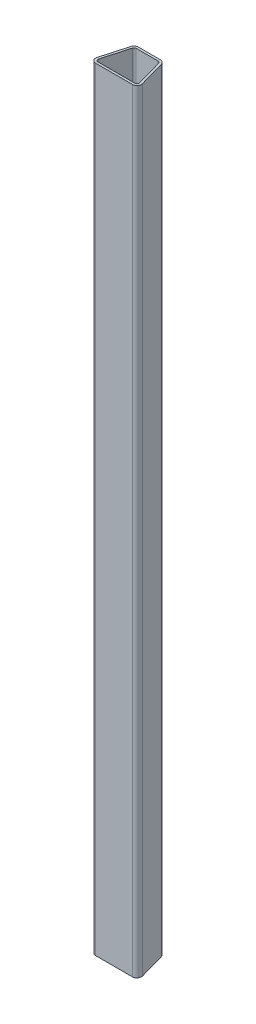
ISO-10303-21;
HEADER;
FILE_DESCRIPTION(('STEP AP214'),'2;1');
FILE_NAME('part.step','',(''),(''),'','','');
FILE_SCHEMA(('AUTOMOTIVE_DESIGN { 1 0 10303 214 1 1 1 1 }'));
ENDSEC;
DATA;
#1=APPLICATION_CONTEXT('core data for automotive mechanical design processes');
#2=APPLICATION_PROTOCOL_DEFINITION('international standard','automotive_design',2000,#1);
#3=PRODUCT_CONTEXT('',#1,'mechanical');
#4=PRODUCT('Part','Part','',(#3));
#5=PRODUCT_RELATED_PRODUCT_CATEGORY('part','',(#4));
#6=PRODUCT_DEFINITION_FORMATION('','',#4);
#7=PRODUCT_DEFINITION_CONTEXT('part definition',#1,'design');
#8=PRODUCT_DEFINITION('design','',#6,#7);
#9=PRODUCT_DEFINITION_SHAPE('','',#8);
#10=(LENGTH_UNIT() NAMED_UNIT(*) SI_UNIT(.MILLI.,.METRE.));
#11=(NAMED_UNIT(*) PLANE_ANGLE_UNIT() SI_UNIT($,.RADIAN.));
#12=(NAMED_UNIT(*) SI_UNIT($,.STERADIAN.) SOLID_ANGLE_UNIT());
#13=UNCERTAINTY_MEASURE_WITH_UNIT(LENGTH_MEASURE(1.E-05),#10,'distance_accuracy_value','');
#14=(GEOMETRIC_REPRESENTATION_CONTEXT(3) GLOBAL_UNCERTAINTY_ASSIGNED_CONTEXT((#13)) GLOBAL_UNIT_ASSIGNED_CONTEXT((#10,
#11,#12)) REPRESENTATION_CONTEXT('',''));
#15=CARTESIAN_POINT('',(0.,0.,0.));
#16=DIRECTION('',(0.,0.,1.));
#17=DIRECTION('',(1.,0.,0.));
#18=AXIS2_PLACEMENT_3D('',#15,#16,#17);
#19=CARTESIAN_POINT('',(8.35990373267567,350.,6.));
#20=DIRECTION('',(0.,1.,0.));
#21=DIRECTION('',(0.,0.,1.));
#22=AXIS2_PLACEMENT_3D('',#19,#20,#21);
#23=PLANE('',#22);
#24=CARTESIAN_POINT('',(8.35990373267567,350.,6.));
#25=DIRECTION('',(0.,1.,0.));
#26=DIRECTION('',(0.,0.,1.));
#27=AXIS2_PLACEMENT_3D('',#24,#25,#26);
#28=CIRCLE('',#27,2.);
#29=CARTESIAN_POINT('',(8.35990373267567,350.,8.));
#30=VERTEX_POINT('',#29);
#31=CARTESIAN_POINT('',(10.2852056129835,350.,5.45850884616343));
#32=VERTEX_POINT('',#31);
#33=EDGE_CURVE('E214',#30,#32,#28,.T.);
#34=ORIENTED_EDGE('',*,*,#33,.T.);
#35=DIRECTION('',(-0.270745576918284,0.,-0.962650940153899));
#36=VECTOR('',#35,1.);
#37=CARTESIAN_POINT('',(6.91020561298346,350.,-6.54149115383657));
#38=LINE('',#37,#36);
#39=CARTESIAN_POINT('',(6.91020561298346,350.,-6.54149115383657));
#40=VERTEX_POINT('',#39);
#41=EDGE_CURVE('E216',#32,#40,#38,.T.);
#42=ORIENTED_EDGE('',*,*,#41,.T.);
#43=CARTESIAN_POINT('',(4.98490373267567,350.,-6.));
#44=DIRECTION('',(0.,1.,0.));
#45=DIRECTION('',(0.,0.,-1.));
#46=AXIS2_PLACEMENT_3D('',#43,#44,#45);
#47=CIRCLE('',#46,2.);
#48=CARTESIAN_POINT('',(4.98490373267567,350.,-8.));
#49=VERTEX_POINT('',#48);
#50=EDGE_CURVE('E221',#40,#49,#47,.T.);
#51=ORIENTED_EDGE('',*,*,#50,.T.);
#52=DIRECTION('',(-1.,0.,0.));
#53=VECTOR('',#52,1.);
#54=CARTESIAN_POINT('',(-4.98490373267567,350.,-8.));
#55=LINE('',#54,#53);
#56=CARTESIAN_POINT('',(-4.98490373267567,350.,-8.));
#57=VERTEX_POINT('',#56);
#58=EDGE_CURVE('E223',#49,#57,#55,.T.);
#59=ORIENTED_EDGE('',*,*,#58,.T.);
#60=CARTESIAN_POINT('',(-4.98490373267567,350.,-6.));
#61=DIRECTION('',(0.,1.,0.));
#62=DIRECTION('',(0.,0.,1.));
#63=AXIS2_PLACEMENT_3D('',#60,#61,#62);
#64=CIRCLE('',#63,2.);
#65=CARTESIAN_POINT('',(-6.91020561298346,350.,-6.54149115383657));
#66=VERTEX_POINT('',#65);
#67=EDGE_CURVE('E224',#57,#66,#64,.T.);
#68=ORIENTED_EDGE('',*,*,#67,.T.);
#69=DIRECTION('',(-0.270745576918284,0.,0.962650940153899));
#70=VECTOR('',#69,1.);
#71=CARTESIAN_POINT('',(-6.91020561298346,350.,-6.54149115383657));
#72=LINE('',#71,#70);
#73=CARTESIAN_POINT('',(-10.2852056129835,350.,5.45850884616343));
#74=VERTEX_POINT('',#73);
#75=EDGE_CURVE('E230',#66,#74,#72,.T.);
#76=ORIENTED_EDGE('',*,*,#75,.T.);
#77=CARTESIAN_POINT('',(-8.35990373267567,350.,6.));
#78=DIRECTION('',(0.,1.,0.));
#79=DIRECTION('',(0.,0.,-1.));
#80=AXIS2_PLACEMENT_3D('',#77,#78,#79);
#81=CIRCLE('',#80,2.);
#82=CARTESIAN_POINT('',(-8.35990373267567,350.,8.));
#83=VERTEX_POINT('',#82);
#84=EDGE_CURVE('E227',#74,#83,#81,.T.);
#85=ORIENTED_EDGE('',*,*,#84,.T.);
#86=DIRECTION('',(1.,0.,0.));
#87=VECTOR('',#86,1.);
#88=CARTESIAN_POINT('',(-8.35990373267567,350.,8.));
#89=LINE('',#88,#87);
#90=EDGE_CURVE('E231',#83,#30,#89,.T.);
#91=ORIENTED_EDGE('',*,*,#90,.T.);
#92=EDGE_LOOP('',(#34,#42,#51,#59,#68,#76,#85,#91));
#93=FACE_BOUND('',#92,.T.);
#94=DIRECTION('',(1.,0.,0.));
#95=VECTOR('',#94,1.);
#96=CARTESIAN_POINT('',(-8.35990373267567,350.,7.));
#97=LINE('',#96,#95);
#98=CARTESIAN_POINT('',(-8.35990373267567,350.,7.));
#99=VERTEX_POINT('',#98);
#100=CARTESIAN_POINT('',(8.35990373267567,350.,7.));
#101=VERTEX_POINT('',#100);
#102=EDGE_CURVE('E156',#99,#101,#97,.T.);
#103=ORIENTED_EDGE('',*,*,#102,.F.);
#104=CARTESIAN_POINT('',(-8.35990373267567,350.,6.));
#105=DIRECTION('',(0.,1.,0.));
#106=DIRECTION('',(0.,0.,-1.));
#107=AXIS2_PLACEMENT_3D('',#104,#105,#106);
#108=CIRCLE('',#107,1.);
#109=CARTESIAN_POINT('',(-9.32255467282957,350.,5.72925442308172));
#110=VERTEX_POINT('',#109);
#111=EDGE_CURVE('E148',#110,#99,#108,.T.);
#112=ORIENTED_EDGE('',*,*,#111,.F.);
#113=DIRECTION('',(-0.270745576918284,0.,0.962650940153899));
#114=VECTOR('',#113,1.);
#115=CARTESIAN_POINT('',(-5.94755467282956,350.,-6.27074557691828));
#116=LINE('',#115,#114);
#117=CARTESIAN_POINT('',(-5.94755467282956,350.,-6.27074557691828));
#118=VERTEX_POINT('',#117);
#119=EDGE_CURVE('E183',#118,#110,#116,.T.);
#120=ORIENTED_EDGE('',*,*,#119,.F.);
#121=CARTESIAN_POINT('',(-4.98490373267567,350.,-6.));
#122=DIRECTION('',(0.,1.,0.));
#123=DIRECTION('',(0.,0.,1.));
#124=AXIS2_PLACEMENT_3D('',#121,#122,#123);
#125=CIRCLE('',#124,0.999999999999999);
#126=CARTESIAN_POINT('',(-4.98490373267567,350.,-7.));
#127=VERTEX_POINT('',#126);
#128=EDGE_CURVE('E181',#127,#118,#125,.T.);
#129=ORIENTED_EDGE('',*,*,#128,.F.);
#130=DIRECTION('',(-1.,0.,0.));
#131=VECTOR('',#130,1.);
#132=CARTESIAN_POINT('',(-4.98490373267567,350.,-7.));
#133=LINE('',#132,#131);
#134=CARTESIAN_POINT('',(4.98490373267567,350.,-7.));
#135=VERTEX_POINT('',#134);
#136=EDGE_CURVE('E177',#135,#127,#133,.T.);
#137=ORIENTED_EDGE('',*,*,#136,.F.);
#138=CARTESIAN_POINT('',(4.98490373267567,350.,-6.));
#139=DIRECTION('',(0.,1.,0.));
#140=DIRECTION('',(0.,0.,-1.));
#141=AXIS2_PLACEMENT_3D('',#138,#139,#140);
#142=CIRCLE('',#141,0.999999999999998);
#143=CARTESIAN_POINT('',(5.94755467282956,350.,-6.27074557691828));
#144=VERTEX_POINT('',#143);
#145=EDGE_CURVE('E180',#144,#135,#142,.T.);
#146=ORIENTED_EDGE('',*,*,#145,.F.);
#147=DIRECTION('',(-0.270745576918284,0.,-0.962650940153899));
#148=VECTOR('',#147,1.);
#149=CARTESIAN_POINT('',(5.94755467282956,350.,-6.27074557691828));
#150=LINE('',#149,#148);
#151=CARTESIAN_POINT('',(9.32255467282956,350.,5.72925442308172));
#152=VERTEX_POINT('',#151);
#153=EDGE_CURVE('E171',#152,#144,#150,.T.);
#154=ORIENTED_EDGE('',*,*,#153,.F.);
#155=CARTESIAN_POINT('',(8.35990373267567,350.,6.));
#156=DIRECTION('',(0.,1.,0.));
#157=DIRECTION('',(0.,0.,1.));
#158=AXIS2_PLACEMENT_3D('',#155,#156,#157);
#159=CIRCLE('',#158,1.);
#160=EDGE_CURVE('E173',#101,#152,#159,.T.);
#161=ORIENTED_EDGE('',*,*,#160,.F.);
#162=EDGE_LOOP('',(#103,#112,#120,#129,#137,#146,#154,#161));
#163=FACE_BOUND('',#162,.T.);
#164=ADVANCED_FACE('F40',(#93,#163),#23,.T.);
#165=CARTESIAN_POINT('',(8.35990373267567,0.,6.));
#166=DIRECTION('',(0.,1.,0.));
#167=DIRECTION('',(0.,0.,1.));
#168=AXIS2_PLACEMENT_3D('',#165,#166,#167);
#169=PLANE('',#168);
#170=CARTESIAN_POINT('',(8.35990373267567,0.,6.));
#171=DIRECTION('',(0.,1.,0.));
#172=DIRECTION('',(0.,0.,1.));
#173=AXIS2_PLACEMENT_3D('',#170,#171,#172);
#174=CIRCLE('',#173,2.);
#175=CARTESIAN_POINT('',(8.35990373267567,0.,8.));
#176=VERTEX_POINT('',#175);
#177=CARTESIAN_POINT('',(10.2852056129835,0.,5.45850884616343));
#178=VERTEX_POINT('',#177);
#179=EDGE_CURVE('E168',#176,#178,#174,.T.);
#180=ORIENTED_EDGE('',*,*,#179,.F.);
#181=DIRECTION('',(1.,0.,0.));
#182=VECTOR('',#181,1.);
#183=CARTESIAN_POINT('',(-8.35990373267567,0.,8.));
#184=LINE('',#183,#182);
#185=CARTESIAN_POINT('',(-8.35990373267567,0.,8.));
#186=VERTEX_POINT('',#185);
#187=EDGE_CURVE('E219',#186,#176,#184,.T.);
#188=ORIENTED_EDGE('',*,*,#187,.F.);
#189=CARTESIAN_POINT('',(-8.35990373267567,0.,6.));
#190=DIRECTION('',(0.,1.,0.));
#191=DIRECTION('',(0.,0.,-1.));
#192=AXIS2_PLACEMENT_3D('',#189,#190,#191);
#193=CIRCLE('',#192,2.);
#194=CARTESIAN_POINT('',(-10.2852056129835,0.,5.45850884616343));
#195=VERTEX_POINT('',#194);
#196=EDGE_CURVE('E247',#195,#186,#193,.T.);
#197=ORIENTED_EDGE('',*,*,#196,.F.);
#198=DIRECTION('',(-0.270745576918284,0.,0.962650940153899));
#199=VECTOR('',#198,1.);
#200=CARTESIAN_POINT('',(-6.91020561298346,0.,-6.54149115383657));
#201=LINE('',#200,#199);
#202=CARTESIAN_POINT('',(-6.91020561298346,0.,-6.54149115383657));
#203=VERTEX_POINT('',#202);
#204=EDGE_CURVE('E243',#203,#195,#201,.T.);
#205=ORIENTED_EDGE('',*,*,#204,.F.);
#206=CARTESIAN_POINT('',(-4.98490373267567,0.,-6.));
#207=DIRECTION('',(0.,1.,0.));
#208=DIRECTION('',(0.,0.,1.));
#209=AXIS2_PLACEMENT_3D('',#206,#207,#208);
#210=CIRCLE('',#209,2.);
#211=CARTESIAN_POINT('',(-4.98490373267567,0.,-8.));
#212=VERTEX_POINT('',#211);
#213=EDGE_CURVE('E242',#212,#203,#210,.T.);
#214=ORIENTED_EDGE('',*,*,#213,.F.);
#215=DIRECTION('',(-1.,0.,0.));
#216=VECTOR('',#215,1.);
#217=CARTESIAN_POINT('',(-4.98490373267567,0.,-8.));
#218=LINE('',#217,#216);
#219=CARTESIAN_POINT('',(4.98490373267567,0.,-8.));
#220=VERTEX_POINT('',#219);
#221=EDGE_CURVE('E238',#220,#212,#218,.T.);
#222=ORIENTED_EDGE('',*,*,#221,.F.);
#223=CARTESIAN_POINT('',(4.98490373267567,0.,-6.));
#224=DIRECTION('',(0.,1.,0.));
#225=DIRECTION('',(0.,0.,-1.));
#226=AXIS2_PLACEMENT_3D('',#223,#224,#225);
#227=CIRCLE('',#226,2.);
#228=CARTESIAN_POINT('',(6.91020561298346,0.,-6.54149115383657));
#229=VERTEX_POINT('',#228);
#230=EDGE_CURVE('E239',#229,#220,#227,.T.);
#231=ORIENTED_EDGE('',*,*,#230,.F.);
#232=DIRECTION('',(-0.270745576918284,0.,-0.962650940153899));
#233=VECTOR('',#232,1.);
#234=CARTESIAN_POINT('',(6.91020561298346,0.,-6.54149115383657));
#235=LINE('',#234,#233);
#236=EDGE_CURVE('E237',#178,#229,#235,.T.);
#237=ORIENTED_EDGE('',*,*,#236,.F.);
#238=EDGE_LOOP('',(#180,#188,#197,#205,#214,#222,#231,#237));
#239=FACE_BOUND('',#238,.T.);
#240=CARTESIAN_POINT('',(-8.35990373267567,0.,6.));
#241=DIRECTION('',(0.,1.,0.));
#242=DIRECTION('',(0.,0.,-1.));
#243=AXIS2_PLACEMENT_3D('',#240,#241,#242);
#244=CIRCLE('',#243,1.);
#245=CARTESIAN_POINT('',(-9.32255467282957,0.,5.72925442308172));
#246=VERTEX_POINT('',#245);
#247=CARTESIAN_POINT('',(-8.35990373267567,0.,7.));
#248=VERTEX_POINT('',#247);
#249=EDGE_CURVE('E58',#246,#248,#244,.T.);
#250=ORIENTED_EDGE('',*,*,#249,.T.);
#251=DIRECTION('',(1.,0.,0.));
#252=VECTOR('',#251,1.);
#253=CARTESIAN_POINT('',(-8.35990373267567,0.,7.));
#254=LINE('',#253,#252);
#255=CARTESIAN_POINT('',(8.35990373267567,0.,7.));
#256=VERTEX_POINT('',#255);
#257=EDGE_CURVE('E165',#248,#256,#254,.T.);
#258=ORIENTED_EDGE('',*,*,#257,.T.);
#259=CARTESIAN_POINT('',(8.35990373267567,0.,6.));
#260=DIRECTION('',(0.,1.,0.));
#261=DIRECTION('',(0.,0.,1.));
#262=AXIS2_PLACEMENT_3D('',#259,#260,#261);
#263=CIRCLE('',#262,1.);
#264=CARTESIAN_POINT('',(9.32255467282956,0.,5.72925442308172));
#265=VERTEX_POINT('',#264);
#266=EDGE_CURVE('E190',#256,#265,#263,.T.);
#267=ORIENTED_EDGE('',*,*,#266,.T.);
#268=DIRECTION('',(-0.270745576918284,0.,-0.962650940153899));
#269=VECTOR('',#268,1.);
#270=CARTESIAN_POINT('',(5.94755467282956,0.,-6.27074557691828));
#271=LINE('',#270,#269);
#272=CARTESIAN_POINT('',(5.94755467282956,0.,-6.27074557691828));
#273=VERTEX_POINT('',#272);
#274=EDGE_CURVE('E189',#265,#273,#271,.T.);
#275=ORIENTED_EDGE('',*,*,#274,.T.);
#276=CARTESIAN_POINT('',(4.98490373267567,0.,-6.));
#277=DIRECTION('',(0.,1.,0.));
#278=DIRECTION('',(0.,0.,-1.));
#279=AXIS2_PLACEMENT_3D('',#276,#277,#278);
#280=CIRCLE('',#279,0.999999999999998);
#281=CARTESIAN_POINT('',(4.98490373267567,0.,-7.));
#282=VERTEX_POINT('',#281);
#283=EDGE_CURVE('E194',#273,#282,#280,.T.);
#284=ORIENTED_EDGE('',*,*,#283,.T.);
#285=DIRECTION('',(-1.,0.,0.));
#286=VECTOR('',#285,1.);
#287=CARTESIAN_POINT('',(-4.98490373267567,0.,-7.));
#288=LINE('',#287,#286);
#289=CARTESIAN_POINT('',(-4.98490373267567,0.,-7.));
#290=VERTEX_POINT('',#289);
#291=EDGE_CURVE('E196',#282,#290,#288,.T.);
#292=ORIENTED_EDGE('',*,*,#291,.T.);
#293=CARTESIAN_POINT('',(-4.98490373267567,0.,-6.));
#294=DIRECTION('',(0.,1.,0.));
#295=DIRECTION('',(0.,0.,1.));
#296=AXIS2_PLACEMENT_3D('',#293,#294,#295);
#297=CIRCLE('',#296,0.999999999999999);
#298=CARTESIAN_POINT('',(-5.94755467282956,0.,-6.27074557691828));
#299=VERTEX_POINT('',#298);
#300=EDGE_CURVE('E198',#290,#299,#297,.T.);
#301=ORIENTED_EDGE('',*,*,#300,.T.);
#302=DIRECTION('',(-0.270745576918284,0.,0.962650940153899));
#303=VECTOR('',#302,1.);
#304=CARTESIAN_POINT('',(-5.94755467282956,0.,-6.27074557691828));
#305=LINE('',#304,#303);
#306=EDGE_CURVE('E159',#299,#246,#305,.T.);
#307=ORIENTED_EDGE('',*,*,#306,.T.);
#308=EDGE_LOOP('',(#250,#258,#267,#275,#284,#292,#301,#307));
#309=FACE_BOUND('',#308,.T.);
#310=ADVANCED_FACE('F276',(#239,#309),#169,.F.);
#311=CARTESIAN_POINT('',(8.35990373267567,350.,6.));
#312=DIRECTION('',(0.,-1.,0.));
#313=DIRECTION('',(0.,0.,-1.));
#314=AXIS2_PLACEMENT_3D('',#311,#312,#313);
#315=CYLINDRICAL_SURFACE('',#314,2.);
#316=ORIENTED_EDGE('',*,*,#179,.T.);
#317=DIRECTION('',(0.,-1.,0.));
#318=VECTOR('',#317,1.);
#319=CARTESIAN_POINT('',(10.2852056129835,350.,5.45850884616343));
#320=LINE('',#319,#318);
#321=EDGE_CURVE('E11',#32,#178,#320,.T.);
#322=ORIENTED_EDGE('',*,*,#321,.F.);
#323=ORIENTED_EDGE('',*,*,#33,.F.);
#324=DIRECTION('',(0.,-1.,0.));
#325=VECTOR('',#324,1.);
#326=CARTESIAN_POINT('',(8.35990373267567,350.,8.));
#327=LINE('',#326,#325);
#328=EDGE_CURVE('E232',#30,#176,#327,.T.);
#329=ORIENTED_EDGE('',*,*,#328,.T.);
#330=EDGE_LOOP('',(#316,#322,#323,#329));
#331=FACE_BOUND('',#330,.T.);
#332=ADVANCED_FACE('F39',(#331),#315,.T.);
#333=CARTESIAN_POINT('',(6.91020561298346,350.,-6.54149115383657));
#334=DIRECTION('',(-0.962650940153899,0.,0.270745576918284));
#335=DIRECTION('',(0.270745576918284,0.,0.962650940153899));
#336=AXIS2_PLACEMENT_3D('',#333,#334,#335);
#337=PLANE('',#336);
#338=ORIENTED_EDGE('',*,*,#236,.T.);
#339=DIRECTION('',(0.,-1.,0.));
#340=VECTOR('',#339,1.);
#341=CARTESIAN_POINT('',(6.91020561298346,350.,-6.54149115383657));
#342=LINE('',#341,#340);
#343=EDGE_CURVE('E44',#40,#229,#342,.T.);
#344=ORIENTED_EDGE('',*,*,#343,.F.);
#345=ORIENTED_EDGE('',*,*,#41,.F.);
#346=ORIENTED_EDGE('',*,*,#321,.T.);
#347=EDGE_LOOP('',(#338,#344,#345,#346));
#348=FACE_BOUND('',#347,.T.);
#349=ADVANCED_FACE('F291',(#348),#337,.F.);
#350=CARTESIAN_POINT('',(4.98490373267567,350.,-6.));
#351=DIRECTION('',(0.,-1.,0.));
#352=DIRECTION('',(0.,0.,-1.));
#353=AXIS2_PLACEMENT_3D('',#350,#351,#352);
#354=CYLINDRICAL_SURFACE('',#353,2.);
#355=ORIENTED_EDGE('',*,*,#230,.T.);
#356=DIRECTION('',(0.,-1.,0.));
#357=VECTOR('',#356,1.);
#358=CARTESIAN_POINT('',(4.98490373267567,350.,-8.));
#359=LINE('',#358,#357);
#360=EDGE_CURVE('E261',#49,#220,#359,.T.);
#361=ORIENTED_EDGE('',*,*,#360,.F.);
#362=ORIENTED_EDGE('',*,*,#50,.F.);
#363=ORIENTED_EDGE('',*,*,#343,.T.);
#364=EDGE_LOOP('',(#355,#361,#362,#363));
#365=FACE_BOUND('',#364,.T.);
#366=ADVANCED_FACE('F269',(#365),#354,.T.);
#367=CARTESIAN_POINT('',(-4.98490373267567,350.,-8.));
#368=DIRECTION('',(0.,0.,1.));
#369=DIRECTION('',(1.,0.,0.));
#370=AXIS2_PLACEMENT_3D('',#367,#368,#369);
#371=PLANE('',#370);
#372=ORIENTED_EDGE('',*,*,#221,.T.);
#373=DIRECTION('',(0.,-1.,0.));
#374=VECTOR('',#373,1.);
#375=CARTESIAN_POINT('',(-4.98490373267567,350.,-8.));
#376=LINE('',#375,#374);
#377=EDGE_CURVE('E259',#57,#212,#376,.T.);
#378=ORIENTED_EDGE('',*,*,#377,.F.);
#379=ORIENTED_EDGE('',*,*,#58,.F.);
#380=ORIENTED_EDGE('',*,*,#360,.T.);
#381=EDGE_LOOP('',(#372,#378,#379,#380));
#382=FACE_BOUND('',#381,.T.);
#383=ADVANCED_FACE('F285',(#382),#371,.F.);
#384=CARTESIAN_POINT('',(-4.98490373267567,350.,-6.));
#385=DIRECTION('',(0.,-1.,0.));
#386=DIRECTION('',(0.,0.,-1.));
#387=AXIS2_PLACEMENT_3D('',#384,#385,#386);
#388=CYLINDRICAL_SURFACE('',#387,2.);
#389=ORIENTED_EDGE('',*,*,#213,.T.);
#390=DIRECTION('',(0.,-1.,0.));
#391=VECTOR('',#390,1.);
#392=CARTESIAN_POINT('',(-6.91020561298346,350.,-6.54149115383657));
#393=LINE('',#392,#391);
#394=EDGE_CURVE('E257',#66,#203,#393,.T.);
#395=ORIENTED_EDGE('',*,*,#394,.F.);
#396=ORIENTED_EDGE('',*,*,#67,.F.);
#397=ORIENTED_EDGE('',*,*,#377,.T.);
#398=EDGE_LOOP('',(#389,#395,#396,#397));
#399=FACE_BOUND('',#398,.T.);
#400=ADVANCED_FACE('F286',(#399),#388,.T.);
#401=CARTESIAN_POINT('',(-6.91020561298346,350.,-6.54149115383657));
#402=DIRECTION('',(0.962650940153899,0.,0.270745576918284));
#403=DIRECTION('',(0.270745576918284,0.,-0.962650940153899));
#404=AXIS2_PLACEMENT_3D('',#401,#402,#403);
#405=PLANE('',#404);
#406=ORIENTED_EDGE('',*,*,#204,.T.);
#407=DIRECTION('',(0.,-1.,0.));
#408=VECTOR('',#407,1.);
#409=CARTESIAN_POINT('',(-10.2852056129835,350.,5.45850884616343));
#410=LINE('',#409,#408);
#411=EDGE_CURVE('E253',#74,#195,#410,.T.);
#412=ORIENTED_EDGE('',*,*,#411,.F.);
#413=ORIENTED_EDGE('',*,*,#75,.F.);
#414=ORIENTED_EDGE('',*,*,#394,.T.);
#415=EDGE_LOOP('',(#406,#412,#413,#414));
#416=FACE_BOUND('',#415,.T.);
#417=ADVANCED_FACE('F308',(#416),#405,.F.);
#418=CARTESIAN_POINT('',(-8.35990373267567,350.,6.));
#419=DIRECTION('',(0.,-1.,0.));
#420=DIRECTION('',(0.,0.,-1.));
#421=AXIS2_PLACEMENT_3D('',#418,#419,#420);
#422=CYLINDRICAL_SURFACE('',#421,2.);
#423=ORIENTED_EDGE('',*,*,#196,.T.);
#424=DIRECTION('',(0.,-1.,0.));
#425=VECTOR('',#424,1.);
#426=CARTESIAN_POINT('',(-8.35990373267567,350.,8.));
#427=LINE('',#426,#425);
#428=EDGE_CURVE('E251',#83,#186,#427,.T.);
#429=ORIENTED_EDGE('',*,*,#428,.F.);
#430=ORIENTED_EDGE('',*,*,#84,.F.);
#431=ORIENTED_EDGE('',*,*,#411,.T.);
#432=EDGE_LOOP('',(#423,#429,#430,#431));
#433=FACE_BOUND('',#432,.T.);
#434=ADVANCED_FACE('F305',(#433),#422,.T.);
#435=CARTESIAN_POINT('',(-8.35990373267567,350.,8.));
#436=DIRECTION('',(0.,0.,-1.));
#437=DIRECTION('',(-1.,0.,0.));
#438=AXIS2_PLACEMENT_3D('',#435,#436,#437);
#439=PLANE('',#438);
#440=ORIENTED_EDGE('',*,*,#187,.T.);
#441=ORIENTED_EDGE('',*,*,#328,.F.);
#442=ORIENTED_EDGE('',*,*,#90,.F.);
#443=ORIENTED_EDGE('',*,*,#428,.T.);
#444=EDGE_LOOP('',(#440,#441,#442,#443));
#445=FACE_BOUND('',#444,.T.);
#446=ADVANCED_FACE('F298',(#445),#439,.F.);
#447=CARTESIAN_POINT('',(-8.35990373267567,350.,6.));
#448=DIRECTION('',(0.,-1.,0.));
#449=DIRECTION('',(0.,0.,-1.));
#450=AXIS2_PLACEMENT_3D('',#447,#448,#449);
#451=CYLINDRICAL_SURFACE('',#450,1.);
#452=ORIENTED_EDGE('',*,*,#249,.F.);
#453=DIRECTION('',(0.,-1.,0.));
#454=VECTOR('',#453,1.);
#455=CARTESIAN_POINT('',(-9.32255467282957,350.,5.72925442308172));
#456=LINE('',#455,#454);
#457=EDGE_CURVE('E153',#110,#246,#456,.T.);
#458=ORIENTED_EDGE('',*,*,#457,.F.);
#459=ORIENTED_EDGE('',*,*,#111,.T.);
#460=DIRECTION('',(0.,-1.,0.));
#461=VECTOR('',#460,1.);
#462=CARTESIAN_POINT('',(-8.35990373267567,350.,7.));
#463=LINE('',#462,#461);
#464=EDGE_CURVE('E154',#99,#248,#463,.T.);
#465=ORIENTED_EDGE('',*,*,#464,.T.);
#466=EDGE_LOOP('',(#452,#458,#459,#465));
#467=FACE_BOUND('',#466,.T.);
#468=ADVANCED_FACE('F152',(#467),#451,.F.);
#469=CARTESIAN_POINT('',(-8.35990373267567,350.,7.));
#470=DIRECTION('',(0.,0.,-1.));
#471=DIRECTION('',(-1.,0.,0.));
#472=AXIS2_PLACEMENT_3D('',#469,#470,#471);
#473=PLANE('',#472);
#474=ORIENTED_EDGE('',*,*,#257,.F.);
#475=ORIENTED_EDGE('',*,*,#464,.F.);
#476=ORIENTED_EDGE('',*,*,#102,.T.);
#477=DIRECTION('',(0.,-1.,0.));
#478=VECTOR('',#477,1.);
#479=CARTESIAN_POINT('',(8.35990373267567,350.,7.));
#480=LINE('',#479,#478);
#481=EDGE_CURVE('E167',#101,#256,#480,.T.);
#482=ORIENTED_EDGE('',*,*,#481,.T.);
#483=EDGE_LOOP('',(#474,#475,#476,#482));
#484=FACE_BOUND('',#483,.T.);
#485=ADVANCED_FACE('F162',(#484),#473,.T.);
#486=CARTESIAN_POINT('',(8.35990373267567,350.,6.));
#487=DIRECTION('',(0.,-1.,0.));
#488=DIRECTION('',(0.,0.,-1.));
#489=AXIS2_PLACEMENT_3D('',#486,#487,#488);
#490=CYLINDRICAL_SURFACE('',#489,1.);
#491=ORIENTED_EDGE('',*,*,#266,.F.);
#492=ORIENTED_EDGE('',*,*,#481,.F.);
#493=ORIENTED_EDGE('',*,*,#160,.T.);
#494=DIRECTION('',(0.,-1.,0.));
#495=VECTOR('',#494,1.);
#496=CARTESIAN_POINT('',(9.32255467282956,350.,5.72925442308172));
#497=LINE('',#496,#495);
#498=EDGE_CURVE('E212',#152,#265,#497,.T.);
#499=ORIENTED_EDGE('',*,*,#498,.T.);
#500=EDGE_LOOP('',(#491,#492,#493,#499));
#501=FACE_BOUND('',#500,.T.);
#502=ADVANCED_FACE('F331',(#501),#490,.F.);
#503=CARTESIAN_POINT('',(5.94755467282956,350.,-6.27074557691828));
#504=DIRECTION('',(-0.962650940153899,0.,0.270745576918284));
#505=DIRECTION('',(0.270745576918284,0.,0.962650940153899));
#506=AXIS2_PLACEMENT_3D('',#503,#504,#505);
#507=PLANE('',#506);
#508=ORIENTED_EDGE('',*,*,#274,.F.);
#509=ORIENTED_EDGE('',*,*,#498,.F.);
#510=ORIENTED_EDGE('',*,*,#153,.T.);
#511=DIRECTION('',(0.,-1.,0.));
#512=VECTOR('',#511,1.);
#513=CARTESIAN_POINT('',(5.94755467282956,350.,-6.27074557691828));
#514=LINE('',#513,#512);
#515=EDGE_CURVE('E210',#144,#273,#514,.T.);
#516=ORIENTED_EDGE('',*,*,#515,.T.);
#517=EDGE_LOOP('',(#508,#509,#510,#516));
#518=FACE_BOUND('',#517,.T.);
#519=ADVANCED_FACE('F335',(#518),#507,.T.);
#520=CARTESIAN_POINT('',(4.98490373267567,350.,-6.));
#521=DIRECTION('',(0.,-1.,0.));
#522=DIRECTION('',(0.,0.,-1.));
#523=AXIS2_PLACEMENT_3D('',#520,#521,#522);
#524=CYLINDRICAL_SURFACE('',#523,0.999999999999998);
#525=ORIENTED_EDGE('',*,*,#283,.F.);
#526=ORIENTED_EDGE('',*,*,#515,.F.);
#527=ORIENTED_EDGE('',*,*,#145,.T.);
#528=DIRECTION('',(0.,-1.,0.));
#529=VECTOR('',#528,1.);
#530=CARTESIAN_POINT('',(4.98490373267567,350.,-7.));
#531=LINE('',#530,#529);
#532=EDGE_CURVE('E209',#135,#282,#531,.T.);
#533=ORIENTED_EDGE('',*,*,#532,.T.);
#534=EDGE_LOOP('',(#525,#526,#527,#533));
#535=FACE_BOUND('',#534,.T.);
#536=ADVANCED_FACE('F341',(#535),#524,.F.);
#537=CARTESIAN_POINT('',(-4.98490373267567,350.,-7.));
#538=DIRECTION('',(0.,0.,1.));
#539=DIRECTION('',(1.,0.,0.));
#540=AXIS2_PLACEMENT_3D('',#537,#538,#539);
#541=PLANE('',#540);
#542=ORIENTED_EDGE('',*,*,#291,.F.);
#543=ORIENTED_EDGE('',*,*,#532,.F.);
#544=ORIENTED_EDGE('',*,*,#136,.T.);
#545=DIRECTION('',(0.,-1.,0.));
#546=VECTOR('',#545,1.);
#547=CARTESIAN_POINT('',(-4.98490373267567,350.,-7.));
#548=LINE('',#547,#546);
#549=EDGE_CURVE('E206',#127,#290,#548,.T.);
#550=ORIENTED_EDGE('',*,*,#549,.T.);
#551=EDGE_LOOP('',(#542,#543,#544,#550));
#552=FACE_BOUND('',#551,.T.);
#553=ADVANCED_FACE('F345',(#552),#541,.T.);
#554=CARTESIAN_POINT('',(-4.98490373267567,350.,-6.));
#555=DIRECTION('',(0.,-1.,0.));
#556=DIRECTION('',(0.,0.,-1.));
#557=AXIS2_PLACEMENT_3D('',#554,#555,#556);
#558=CYLINDRICAL_SURFACE('',#557,0.999999999999999);
#559=ORIENTED_EDGE('',*,*,#300,.F.);
#560=ORIENTED_EDGE('',*,*,#549,.F.);
#561=ORIENTED_EDGE('',*,*,#128,.T.);
#562=DIRECTION('',(0.,-1.,0.));
#563=VECTOR('',#562,1.);
#564=CARTESIAN_POINT('',(-5.94755467282956,350.,-6.27074557691828));
#565=LINE('',#564,#563);
#566=EDGE_CURVE('E55',#118,#299,#565,.T.);
#567=ORIENTED_EDGE('',*,*,#566,.T.);
#568=EDGE_LOOP('',(#559,#560,#561,#567));
#569=FACE_BOUND('',#568,.T.);
#570=ADVANCED_FACE('F350',(#569),#558,.F.);
#571=CARTESIAN_POINT('',(-5.94755467282956,350.,-6.27074557691828));
#572=DIRECTION('',(0.962650940153899,0.,0.270745576918284));
#573=DIRECTION('',(0.270745576918284,0.,-0.962650940153899));
#574=AXIS2_PLACEMENT_3D('',#571,#572,#573);
#575=PLANE('',#574);
#576=ORIENTED_EDGE('',*,*,#306,.F.);
#577=ORIENTED_EDGE('',*,*,#566,.F.);
#578=ORIENTED_EDGE('',*,*,#119,.T.);
#579=ORIENTED_EDGE('',*,*,#457,.T.);
#580=EDGE_LOOP('',(#576,#577,#578,#579));
#581=FACE_BOUND('',#580,.T.);
#582=ADVANCED_FACE('F351',(#581),#575,.T.);
#583=CLOSED_SHELL('',(#164,#310,#332,#349,#366,#383,#400,#417,#434,#446,#468,#485,#502,#519,
#536,#553,#570,#582));
#584=MANIFOLD_SOLID_BREP('B2',#583);
#585=ADVANCED_BREP_SHAPE_REPRESENTATION('',(#18,#584),#14);
#586=SHAPE_DEFINITION_REPRESENTATION(#9,#585);
ENDSEC;
END-ISO-10303-21;
